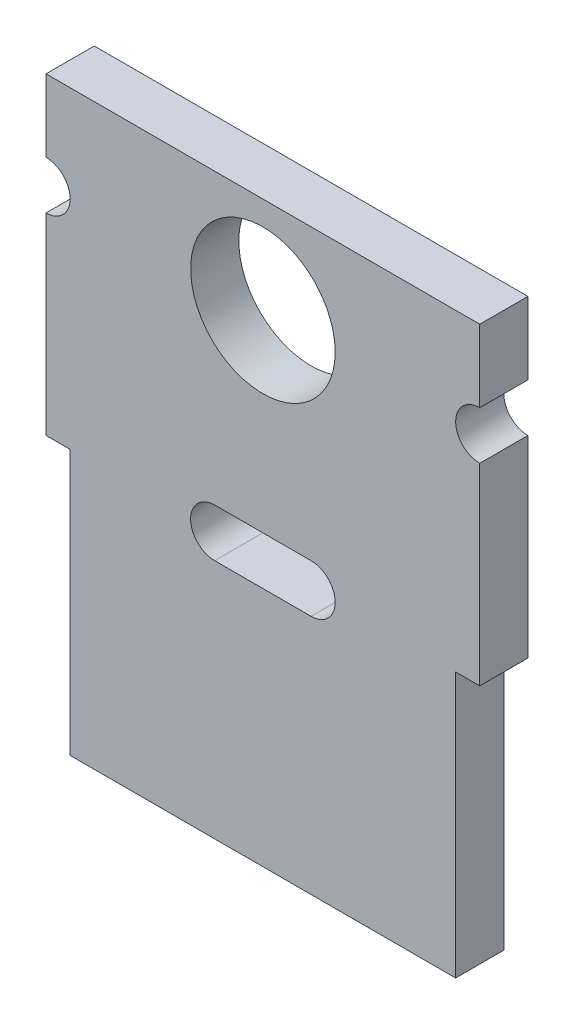
ISO-10303-21;
HEADER;
FILE_DESCRIPTION(('STEP AP214'),'2;1');
FILE_NAME('part.step','',(''),(''),'','','');
FILE_SCHEMA(('AUTOMOTIVE_DESIGN { 1 0 10303 214 1 1 1 1 }'));
ENDSEC;
DATA;
#1=APPLICATION_CONTEXT('core data for automotive mechanical design processes');
#2=APPLICATION_PROTOCOL_DEFINITION('international standard','automotive_design',2000,#1);
#3=PRODUCT_CONTEXT('',#1,'mechanical');
#4=PRODUCT('Part','Part','',(#3));
#5=PRODUCT_RELATED_PRODUCT_CATEGORY('part','',(#4));
#6=PRODUCT_DEFINITION_FORMATION('','',#4);
#7=PRODUCT_DEFINITION_CONTEXT('part definition',#1,'design');
#8=PRODUCT_DEFINITION('design','',#6,#7);
#9=PRODUCT_DEFINITION_SHAPE('','',#8);
#10=(LENGTH_UNIT() NAMED_UNIT(*) SI_UNIT(.MILLI.,.METRE.));
#11=(NAMED_UNIT(*) PLANE_ANGLE_UNIT() SI_UNIT($,.RADIAN.));
#12=(NAMED_UNIT(*) SI_UNIT($,.STERADIAN.) SOLID_ANGLE_UNIT());
#13=UNCERTAINTY_MEASURE_WITH_UNIT(LENGTH_MEASURE(1.E-05),#10,'distance_accuracy_value','');
#14=(GEOMETRIC_REPRESENTATION_CONTEXT(3) GLOBAL_UNCERTAINTY_ASSIGNED_CONTEXT((#13)) GLOBAL_UNIT_ASSIGNED_CONTEXT((#10,
#11,#12)) REPRESENTATION_CONTEXT('',''));
#15=CARTESIAN_POINT('',(0.,0.,0.));
#16=DIRECTION('',(0.,0.,1.));
#17=DIRECTION('',(1.,0.,0.));
#18=AXIS2_PLACEMENT_3D('',#15,#16,#17);
#19=CARTESIAN_POINT('',(-4.,6.,0.));
#20=DIRECTION('',(0.,0.,1.));
#21=DIRECTION('',(1.,0.,0.));
#22=AXIS2_PLACEMENT_3D('',#19,#20,#21);
#23=PLANE('',#22);
#24=DIRECTION('',(1.,0.,0.));
#25=VECTOR('',#24,1.);
#26=CARTESIAN_POINT('',(-3.,5.,0.));
#27=LINE('',#26,#25);
#28=CARTESIAN_POINT('',(-3.,5.,0.));
#29=VERTEX_POINT('',#28);
#30=CARTESIAN_POINT('',(-5.,5.,0.));
#31=VERTEX_POINT('',#30);
#32=EDGE_CURVE('E160',#29,#31,#27,.F.);
#33=ORIENTED_EDGE('',*,*,#32,.F.);
#34=CARTESIAN_POINT('',(-3.,5.5,0.));
#35=DIRECTION('',(0.,0.,1.));
#36=DIRECTION('',(1.,0.,0.));
#37=AXIS2_PLACEMENT_3D('',#34,#35,#36);
#38=CIRCLE('',#37,0.499999999999999);
#39=CARTESIAN_POINT('',(-3.,6.,0.));
#40=VERTEX_POINT('',#39);
#41=EDGE_CURVE('E164',#29,#40,#38,.T.);
#42=ORIENTED_EDGE('',*,*,#41,.T.);
#43=DIRECTION('',(1.,0.,0.));
#44=VECTOR('',#43,1.);
#45=CARTESIAN_POINT('',(-5.,6.,0.));
#46=LINE('',#45,#44);
#47=CARTESIAN_POINT('',(-5.,6.,0.));
#48=VERTEX_POINT('',#47);
#49=EDGE_CURVE('E165',#48,#40,#46,.T.);
#50=ORIENTED_EDGE('',*,*,#49,.F.);
#51=CARTESIAN_POINT('',(-5.,5.5,0.));
#52=DIRECTION('',(0.,0.,1.));
#53=DIRECTION('',(1.,0.,0.));
#54=AXIS2_PLACEMENT_3D('',#51,#52,#53);
#55=CIRCLE('',#54,0.499999999999999);
#56=EDGE_CURVE('E167',#48,#31,#55,.T.);
#57=ORIENTED_EDGE('',*,*,#56,.T.);
#58=EDGE_LOOP('',(#33,#42,#50,#57));
#59=FACE_BOUND('',#58,.T.);
#60=CARTESIAN_POINT('',(-4.,10.,0.));
#61=DIRECTION('',(0.,0.,1.));
#62=DIRECTION('',(1.,0.,0.));
#63=AXIS2_PLACEMENT_3D('',#60,#61,#62);
#64=CIRCLE('',#63,1.5);
#65=CARTESIAN_POINT('',(-2.5,10.,0.));
#66=VERTEX_POINT('',#65);
#67=EDGE_CURVE('E233',#66,#66,#64,.T.);
#68=ORIENTED_EDGE('',*,*,#67,.T.);
#69=EDGE_LOOP('',(#68));
#70=FACE_BOUND('',#69,.T.);
#71=CARTESIAN_POINT('',(-8.50000000000001,10.,0.));
#72=DIRECTION('',(0.,0.,1.));
#73=DIRECTION('',(1.,0.,0.));
#74=AXIS2_PLACEMENT_3D('',#71,#72,#73);
#75=CIRCLE('',#74,0.5);
#76=CARTESIAN_POINT('',(-8.50000000000001,9.5,0.));
#77=VERTEX_POINT('',#76);
#78=CARTESIAN_POINT('',(-8.50000000000001,10.5,0.));
#79=VERTEX_POINT('',#78);
#80=EDGE_CURVE('E235',#77,#79,#75,.T.);
#81=ORIENTED_EDGE('',*,*,#80,.T.);
#82=DIRECTION('',(0.,1.,0.));
#83=VECTOR('',#82,1.);
#84=CARTESIAN_POINT('',(-8.50000000000001,12.,0.));
#85=LINE('',#84,#83);
#86=CARTESIAN_POINT('',(-8.50000000000001,12.,0.));
#87=VERTEX_POINT('',#86);
#88=EDGE_CURVE('E171',#87,#79,#85,.F.);
#89=ORIENTED_EDGE('',*,*,#88,.F.);
#90=DIRECTION('',(1.,0.,0.));
#91=VECTOR('',#90,1.);
#92=CARTESIAN_POINT('',(0.5,12.,0.));
#93=LINE('',#92,#91);
#94=CARTESIAN_POINT('',(0.5,12.,0.));
#95=VERTEX_POINT('',#94);
#96=EDGE_CURVE('E177',#95,#87,#93,.F.);
#97=ORIENTED_EDGE('',*,*,#96,.F.);
#98=DIRECTION('',(0.,1.,0.));
#99=VECTOR('',#98,1.);
#100=CARTESIAN_POINT('',(0.5,10.5,0.));
#101=LINE('',#100,#99);
#102=CARTESIAN_POINT('',(0.5,10.5,0.));
#103=VERTEX_POINT('',#102);
#104=EDGE_CURVE('E88',#103,#95,#101,.T.);
#105=ORIENTED_EDGE('',*,*,#104,.F.);
#106=CARTESIAN_POINT('',(0.5,10.,0.));
#107=DIRECTION('',(0.,0.,1.));
#108=DIRECTION('',(1.,0.,0.));
#109=AXIS2_PLACEMENT_3D('',#106,#107,#108);
#110=CIRCLE('',#109,0.5);
#111=CARTESIAN_POINT('',(0.5,9.5,0.));
#112=VERTEX_POINT('',#111);
#113=EDGE_CURVE('E20',#103,#112,#110,.T.);
#114=ORIENTED_EDGE('',*,*,#113,.T.);
#115=DIRECTION('',(0.,1.,0.));
#116=VECTOR('',#115,1.);
#117=CARTESIAN_POINT('',(0.5,5.5,0.));
#118=LINE('',#117,#116);
#119=CARTESIAN_POINT('',(0.5,5.5,0.));
#120=VERTEX_POINT('',#119);
#121=EDGE_CURVE('E96',#120,#112,#118,.T.);
#122=ORIENTED_EDGE('',*,*,#121,.F.);
#123=DIRECTION('',(1.,0.,0.));
#124=VECTOR('',#123,1.);
#125=CARTESIAN_POINT('',(0.,5.5,0.));
#126=LINE('',#125,#124);
#127=CARTESIAN_POINT('',(0.,5.5,0.));
#128=VERTEX_POINT('',#127);
#129=EDGE_CURVE('E191',#128,#120,#126,.T.);
#130=ORIENTED_EDGE('',*,*,#129,.F.);
#131=DIRECTION('',(0.,1.,0.));
#132=VECTOR('',#131,1.);
#133=CARTESIAN_POINT('',(0.,0.,0.));
#134=LINE('',#133,#132);
#135=CARTESIAN_POINT('',(0.,0.,0.));
#136=VERTEX_POINT('',#135);
#137=EDGE_CURVE('E196',#136,#128,#134,.T.);
#138=ORIENTED_EDGE('',*,*,#137,.F.);
#139=DIRECTION('',(1.,0.,0.));
#140=VECTOR('',#139,1.);
#141=CARTESIAN_POINT('',(-8.,0.,0.));
#142=LINE('',#141,#140);
#143=CARTESIAN_POINT('',(-8.,0.,0.));
#144=VERTEX_POINT('',#143);
#145=EDGE_CURVE('E202',#144,#136,#142,.T.);
#146=ORIENTED_EDGE('',*,*,#145,.F.);
#147=DIRECTION('',(0.,-1.,0.));
#148=VECTOR('',#147,1.);
#149=CARTESIAN_POINT('',(-8.00000000000001,5.5,0.));
#150=LINE('',#149,#148);
#151=CARTESIAN_POINT('',(-8.00000000000001,5.5,0.));
#152=VERTEX_POINT('',#151);
#153=EDGE_CURVE('E134',#152,#144,#150,.T.);
#154=ORIENTED_EDGE('',*,*,#153,.F.);
#155=DIRECTION('',(1.,0.,0.));
#156=VECTOR('',#155,1.);
#157=CARTESIAN_POINT('',(-8.50000000000001,5.5,0.));
#158=LINE('',#157,#156);
#159=CARTESIAN_POINT('',(-8.50000000000001,5.5,0.));
#160=VERTEX_POINT('',#159);
#161=EDGE_CURVE('E128',#160,#152,#158,.T.);
#162=ORIENTED_EDGE('',*,*,#161,.F.);
#163=DIRECTION('',(0.,1.,0.));
#164=VECTOR('',#163,1.);
#165=CARTESIAN_POINT('',(-8.50000000000001,9.5,0.));
#166=LINE('',#165,#164);
#167=EDGE_CURVE('E131',#77,#160,#166,.F.);
#168=ORIENTED_EDGE('',*,*,#167,.F.);
#169=EDGE_LOOP('',(#81,#89,#97,#105,#114,#122,#130,#138,#146,#154,#162,#168));
#170=FACE_BOUND('',#169,.T.);
#171=ADVANCED_FACE('F17',(#59,#70,#170),#23,.F.);
#172=CARTESIAN_POINT('',(-8.50000000000001,9.5,0.));
#173=DIRECTION('',(-1.,0.,0.));
#174=DIRECTION('',(0.,0.,1.));
#175=AXIS2_PLACEMENT_3D('',#172,#173,#174);
#176=PLANE('',#175);
#177=DIRECTION('',(0.,1.,0.));
#178=VECTOR('',#177,1.);
#179=CARTESIAN_POINT('',(-8.50000000000001,6.,1.));
#180=LINE('',#179,#178);
#181=CARTESIAN_POINT('',(-8.50000000000001,9.5,1.));
#182=VERTEX_POINT('',#181);
#183=CARTESIAN_POINT('',(-8.50000000000001,5.5,1.));
#184=VERTEX_POINT('',#183);
#185=EDGE_CURVE('E297',#182,#184,#180,.F.);
#186=ORIENTED_EDGE('',*,*,#185,.F.);
#187=DIRECTION('',(0.,0.,1.));
#188=VECTOR('',#187,1.);
#189=CARTESIAN_POINT('',(-8.50000000000001,9.5,0.));
#190=LINE('',#189,#188);
#191=EDGE_CURVE('E144',#182,#77,#190,.F.);
#192=ORIENTED_EDGE('',*,*,#191,.T.);
#193=ORIENTED_EDGE('',*,*,#167,.T.);
#194=DIRECTION('',(0.,0.,-1.));
#195=VECTOR('',#194,1.);
#196=CARTESIAN_POINT('',(-8.50000000000001,5.5,0.));
#197=LINE('',#196,#195);
#198=EDGE_CURVE('E138',#184,#160,#197,.T.);
#199=ORIENTED_EDGE('',*,*,#198,.F.);
#200=EDGE_LOOP('',(#186,#192,#193,#199));
#201=FACE_BOUND('',#200,.T.);
#202=ADVANCED_FACE('F141',(#201),#176,.T.);
#203=CARTESIAN_POINT('',(-8.50000000000001,5.5,0.));
#204=DIRECTION('',(0.,-1.,0.));
#205=DIRECTION('',(0.,0.,-1.));
#206=AXIS2_PLACEMENT_3D('',#203,#204,#205);
#207=PLANE('',#206);
#208=DIRECTION('',(1.,0.,0.));
#209=VECTOR('',#208,1.);
#210=CARTESIAN_POINT('',(-4.,5.5,1.));
#211=LINE('',#210,#209);
#212=CARTESIAN_POINT('',(-8.00000000000001,5.5,1.));
#213=VERTEX_POINT('',#212);
#214=EDGE_CURVE('E149',#184,#213,#211,.T.);
#215=ORIENTED_EDGE('',*,*,#214,.F.);
#216=ORIENTED_EDGE('',*,*,#198,.T.);
#217=ORIENTED_EDGE('',*,*,#161,.T.);
#218=DIRECTION('',(0.,0.,1.));
#219=VECTOR('',#218,1.);
#220=CARTESIAN_POINT('',(-8.00000000000001,5.5,0.));
#221=LINE('',#220,#219);
#222=EDGE_CURVE('E152',#213,#152,#221,.F.);
#223=ORIENTED_EDGE('',*,*,#222,.F.);
#224=EDGE_LOOP('',(#215,#216,#217,#223));
#225=FACE_BOUND('',#224,.T.);
#226=ADVANCED_FACE('F147',(#225),#207,.T.);
#227=CARTESIAN_POINT('',(-8.00000000000001,5.5,0.));
#228=DIRECTION('',(-1.,0.,0.));
#229=DIRECTION('',(0.,-1.,0.));
#230=AXIS2_PLACEMENT_3D('',#227,#228,#229);
#231=PLANE('',#230);
#232=DIRECTION('',(0.,1.,0.));
#233=VECTOR('',#232,1.);
#234=CARTESIAN_POINT('',(-8.00000000000001,6.,1.));
#235=LINE('',#234,#233);
#236=CARTESIAN_POINT('',(-8.00000000000001,0.,1.));
#237=VERTEX_POINT('',#236);
#238=EDGE_CURVE('E284',#213,#237,#235,.F.);
#239=ORIENTED_EDGE('',*,*,#238,.F.);
#240=ORIENTED_EDGE('',*,*,#222,.T.);
#241=ORIENTED_EDGE('',*,*,#153,.T.);
#242=DIRECTION('',(0.,0.,1.));
#243=VECTOR('',#242,1.);
#244=CARTESIAN_POINT('',(-8.,0.,0.));
#245=LINE('',#244,#243);
#246=EDGE_CURVE('E199',#237,#144,#245,.F.);
#247=ORIENTED_EDGE('',*,*,#246,.F.);
#248=EDGE_LOOP('',(#239,#240,#241,#247));
#249=FACE_BOUND('',#248,.T.);
#250=ADVANCED_FACE('F493',(#249),#231,.T.);
#251=CARTESIAN_POINT('',(-8.,0.,0.));
#252=DIRECTION('',(0.,-1.,0.));
#253=DIRECTION('',(1.,0.,0.));
#254=AXIS2_PLACEMENT_3D('',#251,#252,#253);
#255=PLANE('',#254);
#256=DIRECTION('',(1.,0.,0.));
#257=VECTOR('',#256,1.);
#258=CARTESIAN_POINT('',(-4.,0.,1.));
#259=LINE('',#258,#257);
#260=CARTESIAN_POINT('',(0.,0.,1.));
#261=VERTEX_POINT('',#260);
#262=EDGE_CURVE('E275',#237,#261,#259,.T.);
#263=ORIENTED_EDGE('',*,*,#262,.F.);
#264=ORIENTED_EDGE('',*,*,#246,.T.);
#265=ORIENTED_EDGE('',*,*,#145,.T.);
#266=DIRECTION('',(0.,0.,-1.));
#267=VECTOR('',#266,1.);
#268=CARTESIAN_POINT('',(0.,0.,0.));
#269=LINE('',#268,#267);
#270=EDGE_CURVE('E193',#261,#136,#269,.T.);
#271=ORIENTED_EDGE('',*,*,#270,.F.);
#272=EDGE_LOOP('',(#263,#264,#265,#271));
#273=FACE_BOUND('',#272,.T.);
#274=ADVANCED_FACE('F484',(#273),#255,.T.);
#275=CARTESIAN_POINT('',(0.,0.,0.));
#276=DIRECTION('',(1.,0.,0.));
#277=DIRECTION('',(0.,0.,-1.));
#278=AXIS2_PLACEMENT_3D('',#275,#276,#277);
#279=PLANE('',#278);
#280=DIRECTION('',(0.,1.,0.));
#281=VECTOR('',#280,1.);
#282=CARTESIAN_POINT('',(0.,6.,1.));
#283=LINE('',#282,#281);
#284=CARTESIAN_POINT('',(0.,5.5,1.));
#285=VERTEX_POINT('',#284);
#286=EDGE_CURVE('E266',#261,#285,#283,.T.);
#287=ORIENTED_EDGE('',*,*,#286,.F.);
#288=ORIENTED_EDGE('',*,*,#270,.T.);
#289=ORIENTED_EDGE('',*,*,#137,.T.);
#290=DIRECTION('',(0.,0.,-1.));
#291=VECTOR('',#290,1.);
#292=CARTESIAN_POINT('',(0.,5.5,0.));
#293=LINE('',#292,#291);
#294=EDGE_CURVE('E188',#285,#128,#293,.T.);
#295=ORIENTED_EDGE('',*,*,#294,.F.);
#296=EDGE_LOOP('',(#287,#288,#289,#295));
#297=FACE_BOUND('',#296,.T.);
#298=ADVANCED_FACE('F476',(#297),#279,.T.);
#299=CARTESIAN_POINT('',(0.,5.5,0.));
#300=DIRECTION('',(0.,-1.,0.));
#301=DIRECTION('',(0.,0.,-1.));
#302=AXIS2_PLACEMENT_3D('',#299,#300,#301);
#303=PLANE('',#302);
#304=DIRECTION('',(1.,0.,0.));
#305=VECTOR('',#304,1.);
#306=CARTESIAN_POINT('',(-4.,5.5,1.));
#307=LINE('',#306,#305);
#308=CARTESIAN_POINT('',(0.5,5.5,1.));
#309=VERTEX_POINT('',#308);
#310=EDGE_CURVE('E263',#285,#309,#307,.T.);
#311=ORIENTED_EDGE('',*,*,#310,.F.);
#312=ORIENTED_EDGE('',*,*,#294,.T.);
#313=ORIENTED_EDGE('',*,*,#129,.T.);
#314=DIRECTION('',(0.,0.,-1.));
#315=VECTOR('',#314,1.);
#316=CARTESIAN_POINT('',(0.5,5.5,0.));
#317=LINE('',#316,#315);
#318=EDGE_CURVE('E187',#309,#120,#317,.T.);
#319=ORIENTED_EDGE('',*,*,#318,.F.);
#320=EDGE_LOOP('',(#311,#312,#313,#319));
#321=FACE_BOUND('',#320,.T.);
#322=ADVANCED_FACE('F368',(#321),#303,.T.);
#323=CARTESIAN_POINT('',(0.5,5.5,0.));
#324=DIRECTION('',(1.,0.,0.));
#325=DIRECTION('',(0.,0.,-1.));
#326=AXIS2_PLACEMENT_3D('',#323,#324,#325);
#327=PLANE('',#326);
#328=DIRECTION('',(0.,1.,0.));
#329=VECTOR('',#328,1.);
#330=CARTESIAN_POINT('',(0.5,6.,1.));
#331=LINE('',#330,#329);
#332=CARTESIAN_POINT('',(0.5,9.5,1.));
#333=VERTEX_POINT('',#332);
#334=EDGE_CURVE('E228',#309,#333,#331,.T.);
#335=ORIENTED_EDGE('',*,*,#334,.F.);
#336=ORIENTED_EDGE('',*,*,#318,.T.);
#337=ORIENTED_EDGE('',*,*,#121,.T.);
#338=DIRECTION('',(0.,0.,1.));
#339=VECTOR('',#338,1.);
#340=CARTESIAN_POINT('',(0.5,9.5,0.));
#341=LINE('',#340,#339);
#342=EDGE_CURVE('E258',#112,#333,#341,.T.);
#343=ORIENTED_EDGE('',*,*,#342,.T.);
#344=EDGE_LOOP('',(#335,#336,#337,#343));
#345=FACE_BOUND('',#344,.T.);
#346=ADVANCED_FACE('F338',(#345),#327,.T.);
#347=CARTESIAN_POINT('',(0.5,10.,0.));
#348=DIRECTION('',(0.,0.,1.));
#349=DIRECTION('',(1.,0.,0.));
#350=AXIS2_PLACEMENT_3D('',#347,#348,#349);
#351=CYLINDRICAL_SURFACE('',#350,0.5);
#352=DIRECTION('',(0.,0.,-1.));
#353=VECTOR('',#352,1.);
#354=CARTESIAN_POINT('',(0.5,10.5,0.));
#355=LINE('',#354,#353);
#356=CARTESIAN_POINT('',(0.5,10.5,1.));
#357=VERTEX_POINT('',#356);
#358=EDGE_CURVE('E180',#357,#103,#355,.T.);
#359=ORIENTED_EDGE('',*,*,#358,.F.);
#360=CARTESIAN_POINT('',(0.5,10.,1.));
#361=DIRECTION('',(0.,0.,1.));
#362=DIRECTION('',(1.,0.,0.));
#363=AXIS2_PLACEMENT_3D('',#360,#361,#362);
#364=CIRCLE('',#363,0.5);
#365=EDGE_CURVE('E224',#333,#357,#364,.F.);
#366=ORIENTED_EDGE('',*,*,#365,.F.);
#367=ORIENTED_EDGE('',*,*,#342,.F.);
#368=ORIENTED_EDGE('',*,*,#113,.F.);
#369=EDGE_LOOP('',(#359,#366,#367,#368));
#370=FACE_BOUND('',#369,.T.);
#371=ADVANCED_FACE('F359',(#370),#351,.F.);
#372=CARTESIAN_POINT('',(0.5,10.5,0.));
#373=DIRECTION('',(1.,0.,0.));
#374=DIRECTION('',(0.,0.,-1.));
#375=AXIS2_PLACEMENT_3D('',#372,#373,#374);
#376=PLANE('',#375);
#377=DIRECTION('',(0.,1.,0.));
#378=VECTOR('',#377,1.);
#379=CARTESIAN_POINT('',(0.5,6.,1.));
#380=LINE('',#379,#378);
#381=CARTESIAN_POINT('',(0.5,12.,1.));
#382=VERTEX_POINT('',#381);
#383=EDGE_CURVE('E227',#357,#382,#380,.T.);
#384=ORIENTED_EDGE('',*,*,#383,.F.);
#385=ORIENTED_EDGE('',*,*,#358,.T.);
#386=ORIENTED_EDGE('',*,*,#104,.T.);
#387=DIRECTION('',(0.,0.,1.));
#388=VECTOR('',#387,1.);
#389=CARTESIAN_POINT('',(0.5,12.,0.));
#390=LINE('',#389,#388);
#391=EDGE_CURVE('E174',#382,#95,#390,.F.);
#392=ORIENTED_EDGE('',*,*,#391,.F.);
#393=EDGE_LOOP('',(#384,#385,#386,#392));
#394=FACE_BOUND('',#393,.T.);
#395=ADVANCED_FACE('F357',(#394),#376,.T.);
#396=CARTESIAN_POINT('',(0.5,12.,0.));
#397=DIRECTION('',(0.,1.,0.));
#398=DIRECTION('',(0.,0.,1.));
#399=AXIS2_PLACEMENT_3D('',#396,#397,#398);
#400=PLANE('',#399);
#401=DIRECTION('',(1.,0.,0.));
#402=VECTOR('',#401,1.);
#403=CARTESIAN_POINT('',(-4.,12.,1.));
#404=LINE('',#403,#402);
#405=CARTESIAN_POINT('',(-8.50000000000001,12.,1.));
#406=VERTEX_POINT('',#405);
#407=EDGE_CURVE('E247',#382,#406,#404,.F.);
#408=ORIENTED_EDGE('',*,*,#407,.F.);
#409=ORIENTED_EDGE('',*,*,#391,.T.);
#410=ORIENTED_EDGE('',*,*,#96,.T.);
#411=DIRECTION('',(0.,0.,1.));
#412=VECTOR('',#411,1.);
#413=CARTESIAN_POINT('',(-8.50000000000001,12.,0.));
#414=LINE('',#413,#412);
#415=EDGE_CURVE('E173',#406,#87,#414,.F.);
#416=ORIENTED_EDGE('',*,*,#415,.F.);
#417=EDGE_LOOP('',(#408,#409,#410,#416));
#418=FACE_BOUND('',#417,.T.);
#419=ADVANCED_FACE('F351',(#418),#400,.T.);
#420=CARTESIAN_POINT('',(-8.50000000000001,12.,0.));
#421=DIRECTION('',(-1.,0.,0.));
#422=DIRECTION('',(0.,0.,1.));
#423=AXIS2_PLACEMENT_3D('',#420,#421,#422);
#424=PLANE('',#423);
#425=DIRECTION('',(0.,1.,0.));
#426=VECTOR('',#425,1.);
#427=CARTESIAN_POINT('',(-8.50000000000001,6.,1.));
#428=LINE('',#427,#426);
#429=CARTESIAN_POINT('',(-8.50000000000001,10.5,1.));
#430=VERTEX_POINT('',#429);
#431=EDGE_CURVE('E223',#406,#430,#428,.F.);
#432=ORIENTED_EDGE('',*,*,#431,.F.);
#433=ORIENTED_EDGE('',*,*,#415,.T.);
#434=ORIENTED_EDGE('',*,*,#88,.T.);
#435=DIRECTION('',(0.,0.,1.));
#436=VECTOR('',#435,1.);
#437=CARTESIAN_POINT('',(-8.50000000000001,10.5,0.));
#438=LINE('',#437,#436);
#439=EDGE_CURVE('E238',#79,#430,#438,.T.);
#440=ORIENTED_EDGE('',*,*,#439,.T.);
#441=EDGE_LOOP('',(#432,#433,#434,#440));
#442=FACE_BOUND('',#441,.T.);
#443=ADVANCED_FACE('F353',(#442),#424,.T.);
#444=CARTESIAN_POINT('',(-8.50000000000001,10.,0.));
#445=DIRECTION('',(0.,0.,1.));
#446=DIRECTION('',(1.,0.,0.));
#447=AXIS2_PLACEMENT_3D('',#444,#445,#446);
#448=CYLINDRICAL_SURFACE('',#447,0.5);
#449=ORIENTED_EDGE('',*,*,#191,.F.);
#450=CARTESIAN_POINT('',(-8.50000000000001,10.,1.));
#451=DIRECTION('',(0.,0.,1.));
#452=DIRECTION('',(1.,0.,0.));
#453=AXIS2_PLACEMENT_3D('',#450,#451,#452);
#454=CIRCLE('',#453,0.5);
#455=EDGE_CURVE('E220',#430,#182,#454,.F.);
#456=ORIENTED_EDGE('',*,*,#455,.F.);
#457=ORIENTED_EDGE('',*,*,#439,.F.);
#458=ORIENTED_EDGE('',*,*,#80,.F.);
#459=EDGE_LOOP('',(#449,#456,#457,#458));
#460=FACE_BOUND('',#459,.T.);
#461=ADVANCED_FACE('F388',(#460),#448,.F.);
#462=CARTESIAN_POINT('',(-4.,10.,0.));
#463=DIRECTION('',(0.,0.,1.));
#464=DIRECTION('',(1.,0.,0.));
#465=AXIS2_PLACEMENT_3D('',#462,#463,#464);
#466=CYLINDRICAL_SURFACE('',#465,1.5);
#467=ORIENTED_EDGE('',*,*,#67,.F.);
#468=EDGE_LOOP('',(#467));
#469=FACE_BOUND('',#468,.T.);
#470=CARTESIAN_POINT('',(-4.,10.,1.));
#471=DIRECTION('',(0.,0.,1.));
#472=DIRECTION('',(1.,0.,0.));
#473=AXIS2_PLACEMENT_3D('',#470,#471,#472);
#474=CIRCLE('',#473,1.5);
#475=CARTESIAN_POINT('',(-2.5,10.,1.));
#476=VERTEX_POINT('',#475);
#477=EDGE_CURVE('E217',#476,#476,#474,.F.);
#478=ORIENTED_EDGE('',*,*,#477,.F.);
#479=EDGE_LOOP('',(#478));
#480=FACE_BOUND('',#479,.T.);
#481=ADVANCED_FACE('F385',(#469,#480),#466,.F.);
#482=CARTESIAN_POINT('',(-5.,5.5,0.));
#483=DIRECTION('',(0.,0.,1.));
#484=DIRECTION('',(1.,0.,0.));
#485=AXIS2_PLACEMENT_3D('',#482,#483,#484);
#486=CYLINDRICAL_SURFACE('',#485,0.499999999999999);
#487=DIRECTION('',(0.,0.,-1.));
#488=VECTOR('',#487,1.);
#489=CARTESIAN_POINT('',(-5.,6.,0.));
#490=LINE('',#489,#488);
#491=CARTESIAN_POINT('',(-5.,6.,1.));
#492=VERTEX_POINT('',#491);
#493=EDGE_CURVE('E166',#492,#48,#490,.T.);
#494=ORIENTED_EDGE('',*,*,#493,.F.);
#495=CARTESIAN_POINT('',(-5.,5.5,1.));
#496=DIRECTION('',(0.,0.,1.));
#497=DIRECTION('',(1.,0.,0.));
#498=AXIS2_PLACEMENT_3D('',#495,#496,#497);
#499=CIRCLE('',#498,0.499999999999999);
#500=CARTESIAN_POINT('',(-5.,5.,1.));
#501=VERTEX_POINT('',#500);
#502=EDGE_CURVE('E214',#501,#492,#499,.F.);
#503=ORIENTED_EDGE('',*,*,#502,.F.);
#504=DIRECTION('',(0.,0.,1.));
#505=VECTOR('',#504,1.);
#506=CARTESIAN_POINT('',(-5.,5.,0.));
#507=LINE('',#506,#505);
#508=EDGE_CURVE('E163',#31,#501,#507,.T.);
#509=ORIENTED_EDGE('',*,*,#508,.F.);
#510=ORIENTED_EDGE('',*,*,#56,.F.);
#511=EDGE_LOOP('',(#494,#503,#509,#510));
#512=FACE_BOUND('',#511,.T.);
#513=ADVANCED_FACE('F316',(#512),#486,.F.);
#514=CARTESIAN_POINT('',(-5.,6.,0.));
#515=DIRECTION('',(0.,-1.,0.));
#516=DIRECTION('',(0.,0.,-1.));
#517=AXIS2_PLACEMENT_3D('',#514,#515,#516);
#518=PLANE('',#517);
#519=DIRECTION('',(1.,0.,0.));
#520=VECTOR('',#519,1.);
#521=CARTESIAN_POINT('',(-4.,6.,1.));
#522=LINE('',#521,#520);
#523=CARTESIAN_POINT('',(-3.,6.,1.));
#524=VERTEX_POINT('',#523);
#525=EDGE_CURVE('E213',#492,#524,#522,.T.);
#526=ORIENTED_EDGE('',*,*,#525,.F.);
#527=ORIENTED_EDGE('',*,*,#493,.T.);
#528=ORIENTED_EDGE('',*,*,#49,.T.);
#529=DIRECTION('',(0.,0.,1.));
#530=VECTOR('',#529,1.);
#531=CARTESIAN_POINT('',(-3.,6.,0.));
#532=LINE('',#531,#530);
#533=EDGE_CURVE('E231',#40,#524,#532,.T.);
#534=ORIENTED_EDGE('',*,*,#533,.T.);
#535=EDGE_LOOP('',(#526,#527,#528,#534));
#536=FACE_BOUND('',#535,.T.);
#537=ADVANCED_FACE('F312',(#536),#518,.T.);
#538=CARTESIAN_POINT('',(-3.,5.5,0.));
#539=DIRECTION('',(0.,0.,1.));
#540=DIRECTION('',(1.,0.,0.));
#541=AXIS2_PLACEMENT_3D('',#538,#539,#540);
#542=CYLINDRICAL_SURFACE('',#541,0.499999999999999);
#543=DIRECTION('',(0.,0.,1.));
#544=VECTOR('',#543,1.);
#545=CARTESIAN_POINT('',(-3.,5.,0.));
#546=LINE('',#545,#544);
#547=CARTESIAN_POINT('',(-3.,5.,1.));
#548=VERTEX_POINT('',#547);
#549=EDGE_CURVE('E35',#548,#29,#546,.F.);
#550=ORIENTED_EDGE('',*,*,#549,.F.);
#551=CARTESIAN_POINT('',(-3.,5.5,1.));
#552=DIRECTION('',(0.,0.,1.));
#553=DIRECTION('',(1.,0.,0.));
#554=AXIS2_PLACEMENT_3D('',#551,#552,#553);
#555=CIRCLE('',#554,0.499999999999999);
#556=EDGE_CURVE('E26',#524,#548,#555,.F.);
#557=ORIENTED_EDGE('',*,*,#556,.F.);
#558=ORIENTED_EDGE('',*,*,#533,.F.);
#559=ORIENTED_EDGE('',*,*,#41,.F.);
#560=EDGE_LOOP('',(#550,#557,#558,#559));
#561=FACE_BOUND('',#560,.T.);
#562=ADVANCED_FACE('F321',(#561),#542,.F.);
#563=CARTESIAN_POINT('',(-3.,5.,0.));
#564=DIRECTION('',(0.,1.,0.));
#565=DIRECTION('',(0.,0.,1.));
#566=AXIS2_PLACEMENT_3D('',#563,#564,#565);
#567=PLANE('',#566);
#568=DIRECTION('',(1.,0.,0.));
#569=VECTOR('',#568,1.);
#570=CARTESIAN_POINT('',(-4.,5.,1.));
#571=LINE('',#570,#569);
#572=EDGE_CURVE('E11',#548,#501,#571,.F.);
#573=ORIENTED_EDGE('',*,*,#572,.F.);
#574=ORIENTED_EDGE('',*,*,#549,.T.);
#575=ORIENTED_EDGE('',*,*,#32,.T.);
#576=ORIENTED_EDGE('',*,*,#508,.T.);
#577=EDGE_LOOP('',(#573,#574,#575,#576));
#578=FACE_BOUND('',#577,.T.);
#579=ADVANCED_FACE('F371',(#578),#567,.T.);
#580=CARTESIAN_POINT('',(-4.,6.,1.));
#581=DIRECTION('',(0.,0.,1.));
#582=DIRECTION('',(1.,0.,0.));
#583=AXIS2_PLACEMENT_3D('',#580,#581,#582);
#584=PLANE('',#583);
#585=ORIENTED_EDGE('',*,*,#556,.T.);
#586=ORIENTED_EDGE('',*,*,#572,.T.);
#587=ORIENTED_EDGE('',*,*,#502,.T.);
#588=ORIENTED_EDGE('',*,*,#525,.T.);
#589=EDGE_LOOP('',(#585,#586,#587,#588));
#590=FACE_BOUND('',#589,.T.);
#591=ORIENTED_EDGE('',*,*,#477,.T.);
#592=EDGE_LOOP('',(#591));
#593=FACE_BOUND('',#592,.T.);
#594=ORIENTED_EDGE('',*,*,#431,.T.);
#595=ORIENTED_EDGE('',*,*,#455,.T.);
#596=ORIENTED_EDGE('',*,*,#185,.T.);
#597=ORIENTED_EDGE('',*,*,#214,.T.);
#598=ORIENTED_EDGE('',*,*,#238,.T.);
#599=ORIENTED_EDGE('',*,*,#262,.T.);
#600=ORIENTED_EDGE('',*,*,#286,.T.);
#601=ORIENTED_EDGE('',*,*,#310,.T.);
#602=ORIENTED_EDGE('',*,*,#334,.T.);
#603=ORIENTED_EDGE('',*,*,#365,.T.);
#604=ORIENTED_EDGE('',*,*,#383,.T.);
#605=ORIENTED_EDGE('',*,*,#407,.T.);
#606=EDGE_LOOP('',(#594,#595,#596,#597,#598,#599,#600,#601,#602,#603,#604,#605));
#607=FACE_BOUND('',#606,.T.);
#608=ADVANCED_FACE('F323',(#590,#593,#607),#584,.T.);
#609=CLOSED_SHELL('',(#171,#202,#226,#250,#274,#298,#322,#346,#371,#395,#419,#443,#461,#481,
#513,#537,#562,#579,#608));
#610=MANIFOLD_SOLID_BREP('B1',#609);
#611=ADVANCED_BREP_SHAPE_REPRESENTATION('',(#18,#610),#14);
#612=SHAPE_DEFINITION_REPRESENTATION(#9,#611);
ENDSEC;
END-ISO-10303-21;
